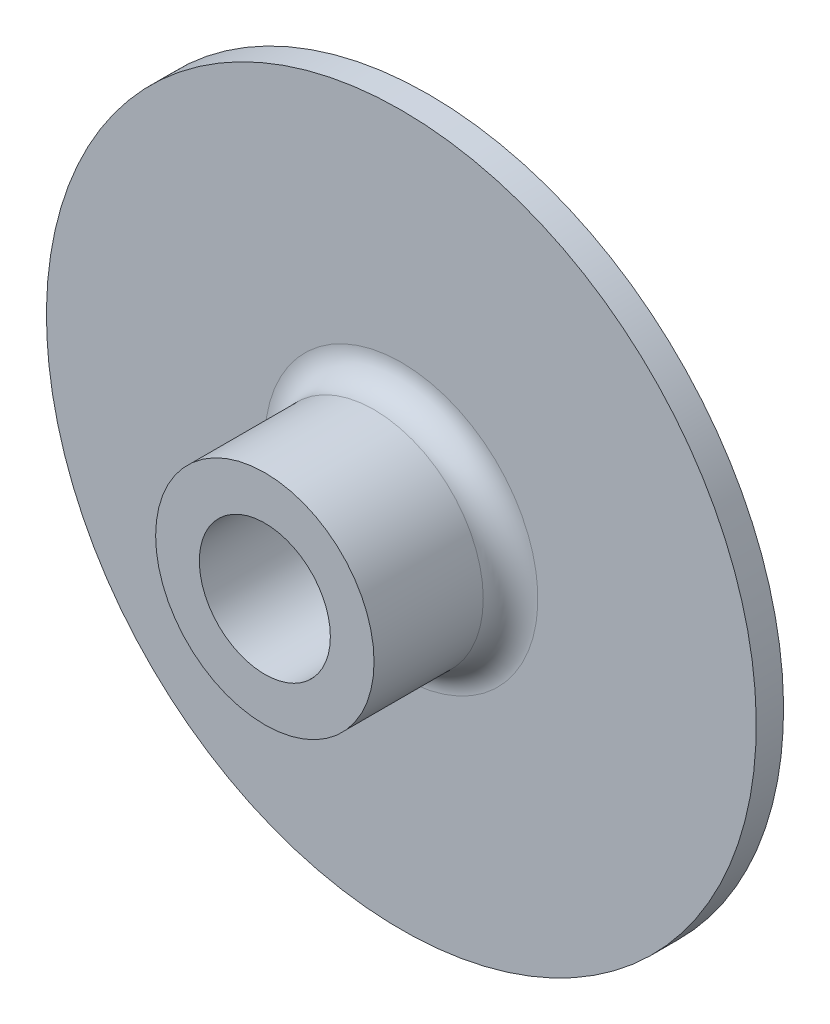
ISO-10303-21;
HEADER;
FILE_DESCRIPTION(('STEP AP214'),'2;1');
FILE_NAME('part.step','',(''),(''),'','','');
FILE_SCHEMA(('AUTOMOTIVE_DESIGN { 1 0 10303 214 1 1 1 1 }'));
ENDSEC;
DATA;
#1=APPLICATION_CONTEXT('core data for automotive mechanical design processes');
#2=APPLICATION_PROTOCOL_DEFINITION('international standard','automotive_design',2000,#1);
#3=PRODUCT_CONTEXT('',#1,'mechanical');
#4=PRODUCT('Part','Part','',(#3));
#5=PRODUCT_RELATED_PRODUCT_CATEGORY('part','',(#4));
#6=PRODUCT_DEFINITION_FORMATION('','',#4);
#7=PRODUCT_DEFINITION_CONTEXT('part definition',#1,'design');
#8=PRODUCT_DEFINITION('design','',#6,#7);
#9=PRODUCT_DEFINITION_SHAPE('','',#8);
#10=(LENGTH_UNIT() NAMED_UNIT(*) SI_UNIT(.MILLI.,.METRE.));
#11=(NAMED_UNIT(*) PLANE_ANGLE_UNIT() SI_UNIT($,.RADIAN.));
#12=(NAMED_UNIT(*) SI_UNIT($,.STERADIAN.) SOLID_ANGLE_UNIT());
#13=UNCERTAINTY_MEASURE_WITH_UNIT(LENGTH_MEASURE(1.E-05),#10,'distance_accuracy_value','');
#14=(GEOMETRIC_REPRESENTATION_CONTEXT(3) GLOBAL_UNCERTAINTY_ASSIGNED_CONTEXT((#13)) GLOBAL_UNIT_ASSIGNED_CONTEXT((#10,
#11,#12)) REPRESENTATION_CONTEXT('',''));
#15=CARTESIAN_POINT('',(0.,0.,0.));
#16=DIRECTION('',(0.,0.,1.));
#17=DIRECTION('',(1.,0.,0.));
#18=AXIS2_PLACEMENT_3D('',#15,#16,#17);
#19=CARTESIAN_POINT('',(0.,0.,19.05));
#20=DIRECTION('',(0.,0.,1.));
#21=DIRECTION('',(0.,-1.,0.));
#22=AXIS2_PLACEMENT_3D('',#19,#20,#21);
#23=PLANE('',#22);
#24=CARTESIAN_POINT('',(0.,0.,19.05));
#25=DIRECTION('',(0.,0.,1.));
#26=DIRECTION('',(1.,0.,0.));
#27=AXIS2_PLACEMENT_3D('',#24,#25,#26);
#28=CIRCLE('',#27,7.62);
#29=CARTESIAN_POINT('',(7.62,0.,19.05));
#30=VERTEX_POINT('',#29);
#31=EDGE_CURVE('E68',#30,#30,#28,.T.);
#32=ORIENTED_EDGE('',*,*,#31,.F.);
#33=EDGE_LOOP('',(#32));
#34=FACE_BOUND('',#33,.T.);
#35=CARTESIAN_POINT('',(0.,0.,19.05));
#36=DIRECTION('',(0.,0.,-1.));
#37=DIRECTION('',(0.,1.,0.));
#38=AXIS2_PLACEMENT_3D('',#35,#36,#37);
#39=CIRCLE('',#38,12.7);
#40=CARTESIAN_POINT('',(0.,12.7,19.05));
#41=VERTEX_POINT('',#40);
#42=EDGE_CURVE('E55',#41,#41,#39,.T.);
#43=ORIENTED_EDGE('',*,*,#42,.F.);
#44=EDGE_LOOP('',(#43));
#45=FACE_BOUND('',#44,.T.);
#46=ADVANCED_FACE('F44',(#34,#45),#23,.T.);
#47=CARTESIAN_POINT('',(0.,0.,0.));
#48=DIRECTION('',(0.,0.,-1.));
#49=DIRECTION('',(0.,1.,0.));
#50=AXIS2_PLACEMENT_3D('',#47,#48,#49);
#51=CYLINDRICAL_SURFACE('',#50,12.7);
#52=CARTESIAN_POINT('',(0.,0.,6.35));
#53=DIRECTION('',(0.,0.,1.));
#54=DIRECTION('',(0.,-1.,0.));
#55=AXIS2_PLACEMENT_3D('',#52,#53,#54);
#56=CIRCLE('',#55,12.7);
#57=CARTESIAN_POINT('',(0.,-12.7,6.34999999999999));
#58=VERTEX_POINT('',#57);
#59=EDGE_CURVE('E12',#58,#58,#56,.T.);
#60=ORIENTED_EDGE('',*,*,#59,.T.);
#61=EDGE_LOOP('',(#60));
#62=FACE_BOUND('',#61,.T.);
#63=ORIENTED_EDGE('',*,*,#42,.T.);
#64=EDGE_LOOP('',(#63));
#65=FACE_BOUND('',#64,.T.);
#66=ADVANCED_FACE('F85',(#62,#65),#51,.T.);
#67=CARTESIAN_POINT('',(0.,12.7,3.175));
#68=DIRECTION('',(0.,0.,1.));
#69=DIRECTION('',(0.,-1.,0.));
#70=AXIS2_PLACEMENT_3D('',#67,#68,#69);
#71=PLANE('',#70);
#72=CARTESIAN_POINT('',(0.,0.,3.175));
#73=DIRECTION('',(0.,0.,1.));
#74=DIRECTION('',(0.,-1.,0.));
#75=AXIS2_PLACEMENT_3D('',#72,#73,#74);
#76=CIRCLE('',#75,15.875);
#77=CARTESIAN_POINT('',(0.,-15.875,3.17499999999999));
#78=VERTEX_POINT('',#77);
#79=EDGE_CURVE('E51',#78,#78,#76,.F.);
#80=ORIENTED_EDGE('',*,*,#79,.T.);
#81=EDGE_LOOP('',(#80));
#82=FACE_BOUND('',#81,.T.);
#83=CARTESIAN_POINT('',(0.,0.,3.17499999999999));
#84=DIRECTION('',(0.,0.,-1.));
#85=DIRECTION('',(0.,1.,0.));
#86=AXIS2_PLACEMENT_3D('',#83,#84,#85);
#87=CIRCLE('',#86,41.275);
#88=CARTESIAN_POINT('',(0.,41.275,3.175));
#89=VERTEX_POINT('',#88);
#90=EDGE_CURVE('E59',#89,#89,#87,.T.);
#91=ORIENTED_EDGE('',*,*,#90,.F.);
#92=EDGE_LOOP('',(#91));
#93=FACE_BOUND('',#92,.T.);
#94=ADVANCED_FACE('F89',(#82,#93),#71,.T.);
#95=CARTESIAN_POINT('',(0.,0.,0.));
#96=DIRECTION('',(0.,0.,-1.));
#97=DIRECTION('',(0.,1.,0.));
#98=AXIS2_PLACEMENT_3D('',#95,#96,#97);
#99=CYLINDRICAL_SURFACE('',#98,41.275);
#100=ORIENTED_EDGE('',*,*,#90,.T.);
#101=EDGE_LOOP('',(#100));
#102=FACE_BOUND('',#101,.T.);
#103=CARTESIAN_POINT('',(0.,0.,0.));
#104=DIRECTION('',(0.,0.,-1.));
#105=DIRECTION('',(0.,1.,0.));
#106=AXIS2_PLACEMENT_3D('',#103,#104,#105);
#107=CIRCLE('',#106,41.275);
#108=CARTESIAN_POINT('',(0.,41.275,0.));
#109=VERTEX_POINT('',#108);
#110=EDGE_CURVE('E64',#109,#109,#107,.T.);
#111=ORIENTED_EDGE('',*,*,#110,.F.);
#112=EDGE_LOOP('',(#111));
#113=FACE_BOUND('',#112,.T.);
#114=ADVANCED_FACE('F94',(#102,#113),#99,.T.);
#115=CARTESIAN_POINT('',(0.,0.,0.));
#116=DIRECTION('',(0.,0.,-1.));
#117=DIRECTION('',(0.,1.,0.));
#118=AXIS2_PLACEMENT_3D('',#115,#116,#117);
#119=PLANE('',#118);
#120=CARTESIAN_POINT('',(0.,0.,0.));
#121=DIRECTION('',(0.,0.,1.));
#122=DIRECTION('',(1.,0.,0.));
#123=AXIS2_PLACEMENT_3D('',#120,#121,#122);
#124=CIRCLE('',#123,7.62);
#125=CARTESIAN_POINT('',(7.62,0.,0.));
#126=VERTEX_POINT('',#125);
#127=EDGE_CURVE('E67',#126,#126,#124,.T.);
#128=ORIENTED_EDGE('',*,*,#127,.T.);
#129=EDGE_LOOP('',(#128));
#130=FACE_BOUND('',#129,.T.);
#131=ORIENTED_EDGE('',*,*,#110,.T.);
#132=EDGE_LOOP('',(#131));
#133=FACE_BOUND('',#132,.T.);
#134=ADVANCED_FACE('F74',(#130,#133),#119,.T.);
#135=CARTESIAN_POINT('',(0.,0.,0.));
#136=DIRECTION('',(0.,0.,1.));
#137=DIRECTION('',(1.,0.,0.));
#138=AXIS2_PLACEMENT_3D('',#135,#136,#137);
#139=CYLINDRICAL_SURFACE('',#138,7.62);
#140=CARTESIAN_POINT('',(7.62,0.,0.));
#141=CARTESIAN_POINT('',(7.62,0.,0.1984375));
#142=CARTESIAN_POINT('',(7.62,0.,0.396875));
#143=CARTESIAN_POINT('',(7.62,0.,0.79375));
#144=CARTESIAN_POINT('',(7.62,0.,0.9921875));
#145=CARTESIAN_POINT('',(7.62,0.,1.3890625));
#146=CARTESIAN_POINT('',(7.62,0.,1.5875));
#147=CARTESIAN_POINT('',(7.62,0.,1.984375));
#148=CARTESIAN_POINT('',(7.62,0.,2.1828125));
#149=CARTESIAN_POINT('',(7.62,0.,2.5796875));
#150=CARTESIAN_POINT('',(7.62,0.,2.778125));
#151=CARTESIAN_POINT('',(7.62,0.,3.175));
#152=CARTESIAN_POINT('',(7.62,0.,3.3734375));
#153=CARTESIAN_POINT('',(7.62,0.,3.7703125));
#154=CARTESIAN_POINT('',(7.62,0.,3.96875));
#155=CARTESIAN_POINT('',(7.62,0.,4.365625));
#156=CARTESIAN_POINT('',(7.62,0.,4.5640625));
#157=CARTESIAN_POINT('',(7.62,0.,4.9609375));
#158=CARTESIAN_POINT('',(7.62,0.,5.159375));
#159=CARTESIAN_POINT('',(7.62,0.,5.55625));
#160=CARTESIAN_POINT('',(7.62,0.,5.7546875));
#161=CARTESIAN_POINT('',(7.62,0.,6.1515625));
#162=CARTESIAN_POINT('',(7.62,0.,6.35));
#163=CARTESIAN_POINT('',(7.62,0.,6.746875));
#164=CARTESIAN_POINT('',(7.62,0.,6.9453125));
#165=CARTESIAN_POINT('',(7.62,0.,7.3421875));
#166=CARTESIAN_POINT('',(7.62,0.,7.540625));
#167=CARTESIAN_POINT('',(7.62,0.,7.9375));
#168=CARTESIAN_POINT('',(7.62,0.,8.1359375));
#169=CARTESIAN_POINT('',(7.62,0.,8.5328125));
#170=CARTESIAN_POINT('',(7.62,0.,8.73125));
#171=CARTESIAN_POINT('',(7.62,0.,9.128125));
#172=CARTESIAN_POINT('',(7.62,0.,9.3265625));
#173=CARTESIAN_POINT('',(7.62,0.,9.7234375));
#174=CARTESIAN_POINT('',(7.62,0.,9.921875));
#175=CARTESIAN_POINT('',(7.62,0.,10.31875));
#176=CARTESIAN_POINT('',(7.62,0.,10.5171875));
#177=CARTESIAN_POINT('',(7.62,0.,10.9140625));
#178=CARTESIAN_POINT('',(7.62,0.,11.1125));
#179=CARTESIAN_POINT('',(7.62,0.,11.509375));
#180=CARTESIAN_POINT('',(7.62,0.,11.7078125));
#181=CARTESIAN_POINT('',(7.62,0.,12.1046875));
#182=CARTESIAN_POINT('',(7.62,0.,12.303125));
#183=CARTESIAN_POINT('',(7.62,0.,12.7));
#184=CARTESIAN_POINT('',(7.62,0.,12.8984375));
#185=CARTESIAN_POINT('',(7.62,0.,13.2953125));
#186=CARTESIAN_POINT('',(7.62,0.,13.49375));
#187=CARTESIAN_POINT('',(7.62,0.,13.890625));
#188=CARTESIAN_POINT('',(7.62,0.,14.0890625));
#189=CARTESIAN_POINT('',(7.62,0.,14.4859375));
#190=CARTESIAN_POINT('',(7.62,0.,14.684375));
#191=CARTESIAN_POINT('',(7.62,0.,15.08125));
#192=CARTESIAN_POINT('',(7.62,0.,15.2796875));
#193=CARTESIAN_POINT('',(7.62,0.,15.6765625));
#194=CARTESIAN_POINT('',(7.62,0.,15.875));
#195=CARTESIAN_POINT('',(7.62,0.,16.271875));
#196=CARTESIAN_POINT('',(7.62,0.,16.4703125));
#197=CARTESIAN_POINT('',(7.62,0.,16.8671875));
#198=CARTESIAN_POINT('',(7.62,0.,17.065625));
#199=CARTESIAN_POINT('',(7.62,0.,17.4625));
#200=CARTESIAN_POINT('',(7.62,0.,17.6609375));
#201=CARTESIAN_POINT('',(7.62,0.,18.0578125));
#202=CARTESIAN_POINT('',(7.62,0.,18.25625));
#203=CARTESIAN_POINT('',(7.62,0.,18.653125));
#204=CARTESIAN_POINT('',(7.62,0.,18.8515625));
#205=CARTESIAN_POINT('',(7.62,0.,19.05));
#206=B_SPLINE_CURVE_WITH_KNOTS('',3,(#140,#141,#142,#143,#144,#145,#146,#147,#148,#149,#150,
#151,#152,#153,#154,#155,#156,#157,#158,#159,#160,#161,#162,#163,#164,#165,#166,#167,#168,#169,
#170,#171,#172,#173,#174,#175,#176,#177,#178,#179,#180,#181,#182,#183,#184,#185,#186,#187,#188,
#189,#190,#191,#192,#193,#194,#195,#196,#197,#198,#199,#200,#201,#202,#203,#204,#205),
.UNSPECIFIED.,.F.,.F.,(4,2,2,2,2,2,2,2,2,2,2,2,2,2,2,2,2,2,2,2,2,2,2,2,2,2,2,2,2,2,2,2,4),(0.,
0.5953125,1.190625,1.7859375,2.38125,2.9765625,3.571875,4.1671875,4.7625,5.3578125,5.953125,
6.5484375,7.14375,7.7390625,8.334375,8.9296875,9.525,10.1203125,10.715625,11.3109375,11.90625,
12.5015625,13.096875,13.6921875,14.2875,14.8828125,15.478125,16.0734375,16.66875,17.2640625,
17.859375,18.4546875,19.05),.UNSPECIFIED.);
#207=EDGE_CURVE('BSEAM77',#126,#30,#206,.T.);
#208=ORIENTED_EDGE('',*,*,#127,.F.);
#209=ORIENTED_EDGE('',*,*,#31,.T.);
#210=ORIENTED_EDGE('',*,*,#207,.T.);
#211=ORIENTED_EDGE('',*,*,#207,.F.);
#212=EDGE_LOOP('',(#208,#210,#209,#211));
#213=FACE_BOUND('',#212,.T.);
#214=ADVANCED_FACE('F77',(#213),#139,.F.);
#215=CARTESIAN_POINT('',(0.,0.,6.35));
#216=DIRECTION('',(0.,0.,1.));
#217=DIRECTION('',(0.,-1.,0.));
#218=AXIS2_PLACEMENT_3D('',#215,#216,#217);
#219=TOROIDAL_SURFACE('',#218,15.875,3.175);
#220=ORIENTED_EDGE('',*,*,#59,.F.);
#221=EDGE_LOOP('',(#220));
#222=FACE_BOUND('',#221,.T.);
#223=ORIENTED_EDGE('',*,*,#79,.F.);
#224=EDGE_LOOP('',(#223));
#225=FACE_BOUND('',#224,.T.);
#226=ADVANCED_FACE('F46',(#222,#225),#219,.F.);
#227=CLOSED_SHELL('',(#46,#66,#94,#114,#134,#214,#226));
#228=MANIFOLD_SOLID_BREP('B2',#227);
#229=ADVANCED_BREP_SHAPE_REPRESENTATION('',(#18,#228),#14);
#230=SHAPE_DEFINITION_REPRESENTATION(#9,#229);
ENDSEC;
END-ISO-10303-21;
